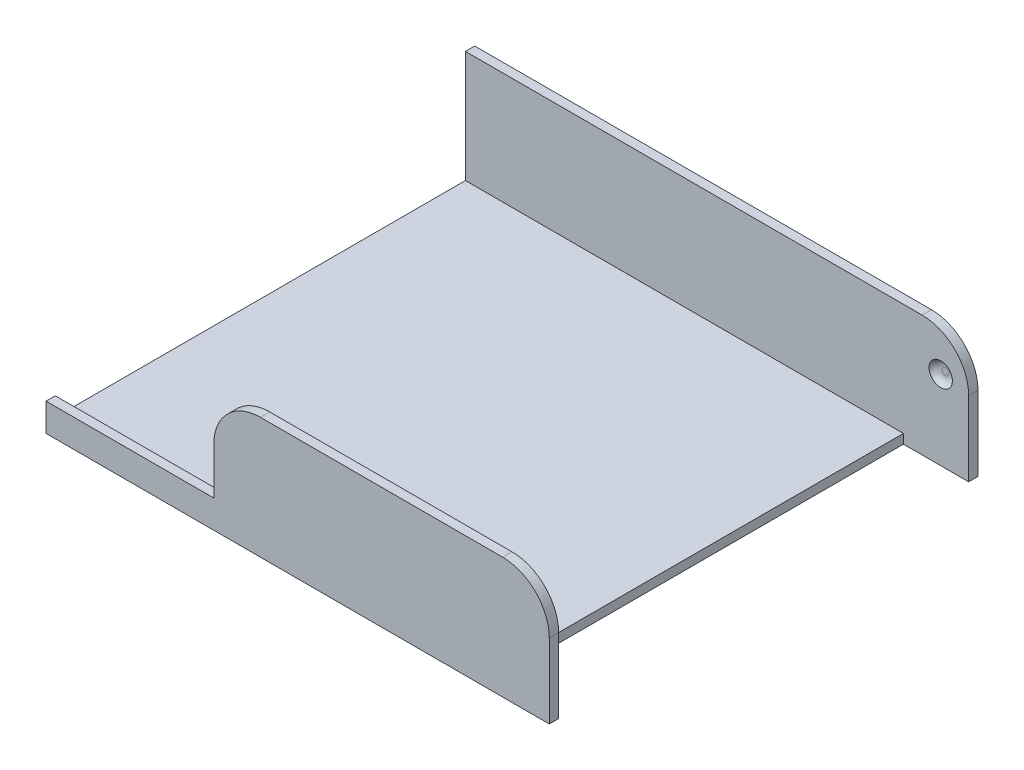
ISO-10303-21;
HEADER;
FILE_DESCRIPTION(('STEP AP214'),'2;1');
FILE_NAME('part.step','',(''),(''),'','','');
FILE_SCHEMA(('AUTOMOTIVE_DESIGN { 1 0 10303 214 1 1 1 1 }'));
ENDSEC;
DATA;
#1=APPLICATION_CONTEXT('core data for automotive mechanical design processes');
#2=APPLICATION_PROTOCOL_DEFINITION('international standard','automotive_design',2000,#1);
#3=PRODUCT_CONTEXT('',#1,'mechanical');
#4=PRODUCT('Part','Part','',(#3));
#5=PRODUCT_RELATED_PRODUCT_CATEGORY('part','',(#4));
#6=PRODUCT_DEFINITION_FORMATION('','',#4);
#7=PRODUCT_DEFINITION_CONTEXT('part definition',#1,'design');
#8=PRODUCT_DEFINITION('design','',#6,#7);
#9=PRODUCT_DEFINITION_SHAPE('','',#8);
#10=(LENGTH_UNIT() NAMED_UNIT(*) SI_UNIT(.MILLI.,.METRE.));
#11=(NAMED_UNIT(*) PLANE_ANGLE_UNIT() SI_UNIT($,.RADIAN.));
#12=(NAMED_UNIT(*) SI_UNIT($,.STERADIAN.) SOLID_ANGLE_UNIT());
#13=UNCERTAINTY_MEASURE_WITH_UNIT(LENGTH_MEASURE(1.E-05),#10,'distance_accuracy_value','');
#14=(GEOMETRIC_REPRESENTATION_CONTEXT(3) GLOBAL_UNCERTAINTY_ASSIGNED_CONTEXT((#13)) GLOBAL_UNIT_ASSIGNED_CONTEXT((#10,
#11,#12)) REPRESENTATION_CONTEXT('',''));
#15=CARTESIAN_POINT('',(0.,0.,0.));
#16=DIRECTION('',(0.,0.,1.));
#17=DIRECTION('',(1.,0.,0.));
#18=AXIS2_PLACEMENT_3D('',#15,#16,#17);
#19=CARTESIAN_POINT('',(108.,0.,0.));
#20=DIRECTION('',(1.,0.,0.));
#21=DIRECTION('',(0.,0.,-1.));
#22=AXIS2_PLACEMENT_3D('',#19,#20,#21);
#23=PLANE('',#22);
#24=DIRECTION('',(0.,-1.,0.));
#25=VECTOR('',#24,1.);
#26=CARTESIAN_POINT('',(108.,26.,-88.));
#27=LINE('',#26,#25);
#28=CARTESIAN_POINT('',(108.,16.,-88.));
#29=VERTEX_POINT('',#28);
#30=CARTESIAN_POINT('',(108.,0.,-88.));
#31=VERTEX_POINT('',#30);
#32=EDGE_CURVE('E203',#29,#31,#27,.T.);
#33=ORIENTED_EDGE('',*,*,#32,.T.);
#34=DIRECTION('',(0.,0.,-1.));
#35=VECTOR('',#34,1.);
#36=CARTESIAN_POINT('',(108.,0.,1.99999999999998));
#37=LINE('',#36,#35);
#38=CARTESIAN_POINT('',(108.,0.,-90.));
#39=VERTEX_POINT('',#38);
#40=EDGE_CURVE('E239',#31,#39,#37,.T.);
#41=ORIENTED_EDGE('',*,*,#40,.T.);
#42=DIRECTION('',(0.,1.,0.));
#43=VECTOR('',#42,1.);
#44=CARTESIAN_POINT('',(108.,26.,-90.));
#45=LINE('',#44,#43);
#46=CARTESIAN_POINT('',(108.,16.,-90.));
#47=VERTEX_POINT('',#46);
#48=EDGE_CURVE('E206',#39,#47,#45,.T.);
#49=ORIENTED_EDGE('',*,*,#48,.T.);
#50=DIRECTION('',(0.,0.,1.));
#51=VECTOR('',#50,1.);
#52=CARTESIAN_POINT('',(108.,16.,0.));
#53=LINE('',#52,#51);
#54=EDGE_CURVE('E197',#47,#29,#53,.T.);
#55=ORIENTED_EDGE('',*,*,#54,.T.);
#56=EDGE_LOOP('',(#33,#41,#49,#55));
#57=FACE_BOUND('',#56,.T.);
#58=ADVANCED_FACE('F35',(#57),#23,.T.);
#59=CARTESIAN_POINT('',(0.,26.,0.));
#60=DIRECTION('',(0.,1.,0.));
#61=DIRECTION('',(0.,0.,1.));
#62=AXIS2_PLACEMENT_3D('',#59,#60,#61);
#63=PLANE('',#62);
#64=DIRECTION('',(-1.,0.,0.));
#65=VECTOR('',#64,1.);
#66=CARTESIAN_POINT('',(0.,26.,-88.));
#67=LINE('',#66,#65);
#68=CARTESIAN_POINT('',(98.,26.,-88.));
#69=VERTEX_POINT('',#68);
#70=CARTESIAN_POINT('',(0.,26.,-88.));
#71=VERTEX_POINT('',#70);
#72=EDGE_CURVE('E218',#69,#71,#67,.T.);
#73=ORIENTED_EDGE('',*,*,#72,.F.);
#74=DIRECTION('',(0.,0.,1.));
#75=VECTOR('',#74,1.);
#76=CARTESIAN_POINT('',(98.,26.,0.));
#77=LINE('',#76,#75);
#78=CARTESIAN_POINT('',(98.,26.,-90.));
#79=VERTEX_POINT('',#78);
#80=EDGE_CURVE('E43',#69,#79,#77,.F.);
#81=ORIENTED_EDGE('',*,*,#80,.T.);
#82=DIRECTION('',(-1.,0.,0.));
#83=VECTOR('',#82,1.);
#84=CARTESIAN_POINT('',(-2.00000000000001,26.,-90.));
#85=LINE('',#84,#83);
#86=CARTESIAN_POINT('',(0.,26.,-90.));
#87=VERTEX_POINT('',#86);
#88=EDGE_CURVE('E170',#79,#87,#85,.T.);
#89=ORIENTED_EDGE('',*,*,#88,.T.);
#90=DIRECTION('',(0.,0.,-1.));
#91=VECTOR('',#90,1.);
#92=CARTESIAN_POINT('',(0.,26.,-90.));
#93=LINE('',#92,#91);
#94=EDGE_CURVE('E247',#71,#87,#93,.T.);
#95=ORIENTED_EDGE('',*,*,#94,.F.);
#96=EDGE_LOOP('',(#73,#81,#89,#95));
#97=FACE_BOUND('',#96,.T.);
#98=ADVANCED_FACE('F285',(#97),#63,.T.);
#99=CARTESIAN_POINT('',(-2.,26.,2.));
#100=DIRECTION('',(0.,0.,-1.));
#101=DIRECTION('',(-1.,0.,0.));
#102=AXIS2_PLACEMENT_3D('',#99,#100,#101);
#103=PLANE('',#102);
#104=DIRECTION('',(0.,-1.,0.));
#105=VECTOR('',#104,1.);
#106=CARTESIAN_POINT('',(108.,26.,2.));
#107=LINE('',#106,#105);
#108=CARTESIAN_POINT('',(108.,16.,1.99999999999999));
#109=VERTEX_POINT('',#108);
#110=CARTESIAN_POINT('',(108.,0.,2.));
#111=VERTEX_POINT('',#110);
#112=EDGE_CURVE('E275',#109,#111,#107,.T.);
#113=ORIENTED_EDGE('',*,*,#112,.F.);
#114=CARTESIAN_POINT('',(98.,16.,2.));
#115=DIRECTION('',(0.,0.,-1.));
#116=DIRECTION('',(-1.,0.,0.));
#117=AXIS2_PLACEMENT_3D('',#114,#115,#116);
#118=CIRCLE('',#117,10.);
#119=CARTESIAN_POINT('',(98.,26.,2.));
#120=VERTEX_POINT('',#119);
#121=EDGE_CURVE('E191',#109,#120,#118,.F.);
#122=ORIENTED_EDGE('',*,*,#121,.T.);
#123=DIRECTION('',(1.,0.,0.));
#124=VECTOR('',#123,1.);
#125=CARTESIAN_POINT('',(-2.,26.,2.));
#126=LINE('',#125,#124);
#127=CARTESIAN_POINT('',(46.,26.,2.));
#128=VERTEX_POINT('',#127);
#129=EDGE_CURVE('E224',#128,#120,#126,.T.);
#130=ORIENTED_EDGE('',*,*,#129,.F.);
#131=CARTESIAN_POINT('',(46.,16.,2.));
#132=DIRECTION('',(0.,0.,-1.));
#133=DIRECTION('',(-1.,0.,0.));
#134=AXIS2_PLACEMENT_3D('',#131,#132,#133);
#135=CIRCLE('',#134,10.);
#136=CARTESIAN_POINT('',(36.,16.,2.));
#137=VERTEX_POINT('',#136);
#138=EDGE_CURVE('E182',#128,#137,#135,.F.);
#139=ORIENTED_EDGE('',*,*,#138,.T.);
#140=DIRECTION('',(0.,1.,0.));
#141=VECTOR('',#140,1.);
#142=CARTESIAN_POINT('',(36.,26.,2.));
#143=LINE('',#142,#141);
#144=CARTESIAN_POINT('',(36.,6.,2.));
#145=VERTEX_POINT('',#144);
#146=EDGE_CURVE('E260',#145,#137,#143,.T.);
#147=ORIENTED_EDGE('',*,*,#146,.F.);
#148=DIRECTION('',(1.,0.,0.));
#149=VECTOR('',#148,1.);
#150=CARTESIAN_POINT('',(-2.,6.,2.));
#151=LINE('',#150,#149);
#152=CARTESIAN_POINT('',(0.,6.,2.));
#153=VERTEX_POINT('',#152);
#154=EDGE_CURVE('E255',#153,#145,#151,.T.);
#155=ORIENTED_EDGE('',*,*,#154,.F.);
#156=DIRECTION('',(0.,1.,0.));
#157=VECTOR('',#156,1.);
#158=CARTESIAN_POINT('',(0.,26.,2.));
#159=LINE('',#158,#157);
#160=CARTESIAN_POINT('',(0.,0.,2.));
#161=VERTEX_POINT('',#160);
#162=EDGE_CURVE('E245',#161,#153,#159,.T.);
#163=ORIENTED_EDGE('',*,*,#162,.F.);
#164=DIRECTION('',(1.,0.,0.));
#165=VECTOR('',#164,1.);
#166=CARTESIAN_POINT('',(-2.,0.,2.));
#167=LINE('',#166,#165);
#168=EDGE_CURVE('E223',#161,#111,#167,.T.);
#169=ORIENTED_EDGE('',*,*,#168,.T.);
#170=EDGE_LOOP('',(#113,#122,#130,#139,#147,#155,#163,#169));
#171=FACE_BOUND('',#170,.T.);
#172=ADVANCED_FACE('F301',(#171),#103,.F.);
#173=CARTESIAN_POINT('',(-2.00000000000001,26.,-90.));
#174=DIRECTION('',(0.,0.,1.));
#175=DIRECTION('',(1.,0.,0.));
#176=AXIS2_PLACEMENT_3D('',#173,#174,#175);
#177=PLANE('',#176);
#178=ORIENTED_EDGE('',*,*,#88,.F.);
#179=CARTESIAN_POINT('',(98.,16.,-90.));
#180=DIRECTION('',(0.,0.,1.));
#181=DIRECTION('',(1.,0.,0.));
#182=AXIS2_PLACEMENT_3D('',#179,#180,#181);
#183=CIRCLE('',#182,10.);
#184=EDGE_CURVE('E11',#79,#47,#183,.F.);
#185=ORIENTED_EDGE('',*,*,#184,.T.);
#186=ORIENTED_EDGE('',*,*,#48,.F.);
#187=DIRECTION('',(-1.,0.,0.));
#188=VECTOR('',#187,1.);
#189=CARTESIAN_POINT('',(-2.00000000000001,0.,-90.));
#190=LINE('',#189,#188);
#191=CARTESIAN_POINT('',(0.,0.,-90.));
#192=VERTEX_POINT('',#191);
#193=EDGE_CURVE('E227',#39,#192,#190,.T.);
#194=ORIENTED_EDGE('',*,*,#193,.T.);
#195=DIRECTION('',(0.,-1.,0.));
#196=VECTOR('',#195,1.);
#197=CARTESIAN_POINT('',(0.,26.,-90.));
#198=LINE('',#197,#196);
#199=EDGE_CURVE('E235',#87,#192,#198,.T.);
#200=ORIENTED_EDGE('',*,*,#199,.F.);
#201=EDGE_LOOP('',(#178,#185,#186,#194,#200));
#202=FACE_BOUND('',#201,.T.);
#203=ADVANCED_FACE('F234',(#202),#177,.F.);
#204=CARTESIAN_POINT('',(0.,0.,0.));
#205=DIRECTION('',(0.,-1.,0.));
#206=DIRECTION('',(0.,0.,-1.));
#207=AXIS2_PLACEMENT_3D('',#204,#205,#206);
#208=PLANE('',#207);
#209=DIRECTION('',(1.,0.,0.));
#210=VECTOR('',#209,1.);
#211=CARTESIAN_POINT('',(108.,0.,-88.));
#212=LINE('',#211,#210);
#213=CARTESIAN_POINT('',(94.,0.,-88.));
#214=VERTEX_POINT('',#213);
#215=EDGE_CURVE('E161',#214,#31,#212,.T.);
#216=ORIENTED_EDGE('',*,*,#215,.F.);
#217=DIRECTION('',(0.,0.,-1.));
#218=VECTOR('',#217,1.);
#219=CARTESIAN_POINT('',(94.,0.,0.));
#220=LINE('',#219,#218);
#221=CARTESIAN_POINT('',(94.,0.,0.));
#222=VERTEX_POINT('',#221);
#223=EDGE_CURVE('E319',#222,#214,#220,.T.);
#224=ORIENTED_EDGE('',*,*,#223,.F.);
#225=DIRECTION('',(-1.,0.,0.));
#226=VECTOR('',#225,1.);
#227=CARTESIAN_POINT('',(108.,0.,0.));
#228=LINE('',#227,#226);
#229=CARTESIAN_POINT('',(108.,0.,0.));
#230=VERTEX_POINT('',#229);
#231=EDGE_CURVE('E149',#230,#222,#228,.T.);
#232=ORIENTED_EDGE('',*,*,#231,.F.);
#233=EDGE_CURVE('E277',#111,#230,#37,.T.);
#234=ORIENTED_EDGE('',*,*,#233,.F.);
#235=ORIENTED_EDGE('',*,*,#168,.F.);
#236=DIRECTION('',(0.,0.,1.));
#237=VECTOR('',#236,1.);
#238=CARTESIAN_POINT('',(0.,0.,-90.));
#239=LINE('',#238,#237);
#240=EDGE_CURVE('E241',#192,#161,#239,.T.);
#241=ORIENTED_EDGE('',*,*,#240,.F.);
#242=ORIENTED_EDGE('',*,*,#193,.F.);
#243=ORIENTED_EDGE('',*,*,#40,.F.);
#244=EDGE_LOOP('',(#216,#224,#232,#234,#235,#241,#242,#243));
#245=FACE_BOUND('',#244,.T.);
#246=ADVANCED_FACE('F238',(#245),#208,.T.);
#247=CARTESIAN_POINT('',(-2.,6.,0.));
#248=DIRECTION('',(0.,-1.,0.));
#249=DIRECTION('',(0.,0.,-1.));
#250=AXIS2_PLACEMENT_3D('',#247,#248,#249);
#251=PLANE('',#250);
#252=DIRECTION('',(0.,0.,-1.));
#253=VECTOR('',#252,1.);
#254=CARTESIAN_POINT('',(0.,6.,0.));
#255=LINE('',#254,#253);
#256=CARTESIAN_POINT('',(0.,6.,0.));
#257=VERTEX_POINT('',#256);
#258=EDGE_CURVE('E253',#153,#257,#255,.T.);
#259=ORIENTED_EDGE('',*,*,#258,.F.);
#260=ORIENTED_EDGE('',*,*,#154,.T.);
#261=DIRECTION('',(0.,0.,1.));
#262=VECTOR('',#261,1.);
#263=CARTESIAN_POINT('',(36.,6.,0.));
#264=LINE('',#263,#262);
#265=CARTESIAN_POINT('',(36.,6.,0.));
#266=VERTEX_POINT('',#265);
#267=EDGE_CURVE('E263',#266,#145,#264,.T.);
#268=ORIENTED_EDGE('',*,*,#267,.F.);
#269=DIRECTION('',(1.,0.,0.));
#270=VECTOR('',#269,1.);
#271=CARTESIAN_POINT('',(-2.,6.,0.));
#272=LINE('',#271,#270);
#273=EDGE_CURVE('E256',#257,#266,#272,.T.);
#274=ORIENTED_EDGE('',*,*,#273,.F.);
#275=EDGE_LOOP('',(#259,#260,#268,#274));
#276=FACE_BOUND('',#275,.T.);
#277=ADVANCED_FACE('F330',(#276),#251,.F.);
#278=ORIENTED_EDGE('',*,*,#129,.T.);
#279=DIRECTION('',(0.,0.,1.));
#280=VECTOR('',#279,1.);
#281=CARTESIAN_POINT('',(98.,26.,0.));
#282=LINE('',#281,#280);
#283=CARTESIAN_POINT('',(98.,26.,0.));
#284=VERTEX_POINT('',#283);
#285=EDGE_CURVE('E193',#120,#284,#282,.F.);
#286=ORIENTED_EDGE('',*,*,#285,.T.);
#287=DIRECTION('',(1.,0.,0.));
#288=VECTOR('',#287,1.);
#289=CARTESIAN_POINT('',(0.,26.,0.));
#290=LINE('',#289,#288);
#291=CARTESIAN_POINT('',(46.,26.,0.));
#292=VERTEX_POINT('',#291);
#293=EDGE_CURVE('E281',#292,#284,#290,.T.);
#294=ORIENTED_EDGE('',*,*,#293,.F.);
#295=DIRECTION('',(0.,0.,1.));
#296=VECTOR('',#295,1.);
#297=CARTESIAN_POINT('',(46.,26.,2.));
#298=LINE('',#297,#296);
#299=EDGE_CURVE('E179',#292,#128,#298,.T.);
#300=ORIENTED_EDGE('',*,*,#299,.T.);
#301=EDGE_LOOP('',(#278,#286,#294,#300));
#302=FACE_BOUND('',#301,.T.);
#303=ADVANCED_FACE('F303',(#302),#63,.T.);
#304=CARTESIAN_POINT('',(0.,2.,0.));
#305=DIRECTION('',(0.,-1.,0.));
#306=DIRECTION('',(0.,0.,-1.));
#307=AXIS2_PLACEMENT_3D('',#304,#305,#306);
#308=PLANE('',#307);
#309=DIRECTION('',(1.,0.,0.));
#310=VECTOR('',#309,1.);
#311=CARTESIAN_POINT('',(0.,2.,0.));
#312=LINE('',#311,#310);
#313=CARTESIAN_POINT('',(0.,2.,0.));
#314=VERTEX_POINT('',#313);
#315=CARTESIAN_POINT('',(94.,2.,0.));
#316=VERTEX_POINT('',#315);
#317=EDGE_CURVE('E147',#314,#316,#312,.T.);
#318=ORIENTED_EDGE('',*,*,#317,.T.);
#319=DIRECTION('',(0.,0.,-1.));
#320=VECTOR('',#319,1.);
#321=CARTESIAN_POINT('',(94.,2.,0.));
#322=LINE('',#321,#320);
#323=CARTESIAN_POINT('',(94.,2.,-88.));
#324=VERTEX_POINT('',#323);
#325=EDGE_CURVE('E154',#316,#324,#322,.T.);
#326=ORIENTED_EDGE('',*,*,#325,.T.);
#327=DIRECTION('',(1.,0.,0.));
#328=VECTOR('',#327,1.);
#329=CARTESIAN_POINT('',(0.,2.,-88.));
#330=LINE('',#329,#328);
#331=CARTESIAN_POINT('',(0.,2.,-88.));
#332=VERTEX_POINT('',#331);
#333=EDGE_CURVE('E166',#332,#324,#330,.T.);
#334=ORIENTED_EDGE('',*,*,#333,.F.);
#335=DIRECTION('',(0.,0.,1.));
#336=VECTOR('',#335,1.);
#337=CARTESIAN_POINT('',(0.,2.,-88.));
#338=LINE('',#337,#336);
#339=EDGE_CURVE('E165',#332,#314,#338,.T.);
#340=ORIENTED_EDGE('',*,*,#339,.T.);
#341=EDGE_LOOP('',(#318,#326,#334,#340));
#342=FACE_BOUND('',#341,.T.);
#343=ADVANCED_FACE('F164',(#342),#308,.F.);
#344=CARTESIAN_POINT('',(0.,26.,0.));
#345=DIRECTION('',(0.,0.,-1.));
#346=DIRECTION('',(-1.,0.,0.));
#347=AXIS2_PLACEMENT_3D('',#344,#345,#346);
#348=PLANE('',#347);
#349=ORIENTED_EDGE('',*,*,#293,.T.);
#350=CARTESIAN_POINT('',(98.,16.,0.));
#351=DIRECTION('',(0.,0.,-1.));
#352=DIRECTION('',(-1.,0.,0.));
#353=AXIS2_PLACEMENT_3D('',#350,#351,#352);
#354=CIRCLE('',#353,10.);
#355=CARTESIAN_POINT('',(108.,16.,0.));
#356=VERTEX_POINT('',#355);
#357=EDGE_CURVE('E195',#284,#356,#354,.T.);
#358=ORIENTED_EDGE('',*,*,#357,.T.);
#359=DIRECTION('',(0.,-1.,0.));
#360=VECTOR('',#359,1.);
#361=CARTESIAN_POINT('',(108.,26.,0.));
#362=LINE('',#361,#360);
#363=EDGE_CURVE('E212',#356,#230,#362,.T.);
#364=ORIENTED_EDGE('',*,*,#363,.T.);
#365=ORIENTED_EDGE('',*,*,#231,.T.);
#366=DIRECTION('',(0.,-1.,0.));
#367=VECTOR('',#366,1.);
#368=CARTESIAN_POINT('',(94.,2.,0.));
#369=LINE('',#368,#367);
#370=EDGE_CURVE('E140',#316,#222,#369,.T.);
#371=ORIENTED_EDGE('',*,*,#370,.F.);
#372=ORIENTED_EDGE('',*,*,#317,.F.);
#373=DIRECTION('',(0.,-1.,0.));
#374=VECTOR('',#373,1.);
#375=CARTESIAN_POINT('',(0.,26.,0.));
#376=LINE('',#375,#374);
#377=EDGE_CURVE('E215',#257,#314,#376,.T.);
#378=ORIENTED_EDGE('',*,*,#377,.F.);
#379=ORIENTED_EDGE('',*,*,#273,.T.);
#380=DIRECTION('',(0.,1.,0.));
#381=VECTOR('',#380,1.);
#382=CARTESIAN_POINT('',(36.,26.,0.));
#383=LINE('',#382,#381);
#384=CARTESIAN_POINT('',(36.,16.,0.));
#385=VERTEX_POINT('',#384);
#386=EDGE_CURVE('E259',#266,#385,#383,.T.);
#387=ORIENTED_EDGE('',*,*,#386,.T.);
#388=CARTESIAN_POINT('',(46.,16.,0.));
#389=DIRECTION('',(0.,0.,-1.));
#390=DIRECTION('',(-1.,0.,0.));
#391=AXIS2_PLACEMENT_3D('',#388,#389,#390);
#392=CIRCLE('',#391,10.);
#393=EDGE_CURVE('E186',#385,#292,#392,.T.);
#394=ORIENTED_EDGE('',*,*,#393,.T.);
#395=EDGE_LOOP('',(#349,#358,#364,#365,#371,#372,#378,#379,#387,#394));
#396=FACE_BOUND('',#395,.T.);
#397=CARTESIAN_POINT('',(102.,17.,0.));
#398=DIRECTION('',(0.,0.,-1.));
#399=DIRECTION('',(-1.,0.,0.));
#400=AXIS2_PLACEMENT_3D('',#397,#398,#399);
#401=CIRCLE('',#400,2.75000000000001);
#402=CARTESIAN_POINT('',(99.25,17.,0.));
#403=VERTEX_POINT('',#402);
#404=EDGE_CURVE('E272',#403,#403,#401,.T.);
#405=ORIENTED_EDGE('',*,*,#404,.F.);
#406=EDGE_LOOP('',(#405));
#407=FACE_BOUND('',#406,.T.);
#408=ADVANCED_FACE('F143',(#396,#407),#348,.T.);
#409=CARTESIAN_POINT('',(0.,26.,-88.));
#410=DIRECTION('',(0.,0.,1.));
#411=DIRECTION('',(1.,0.,0.));
#412=AXIS2_PLACEMENT_3D('',#409,#410,#411);
#413=PLANE('',#412);
#414=CARTESIAN_POINT('',(102.,17.,-88.));
#415=DIRECTION('',(0.,0.,1.));
#416=DIRECTION('',(1.,0.,0.));
#417=AXIS2_PLACEMENT_3D('',#414,#415,#416);
#418=CIRCLE('',#417,2.50000000000001);
#419=CARTESIAN_POINT('',(104.5,17.,-88.));
#420=VERTEX_POINT('',#419);
#421=EDGE_CURVE('E269',#420,#420,#418,.T.);
#422=ORIENTED_EDGE('',*,*,#421,.F.);
#423=EDGE_LOOP('',(#422));
#424=FACE_BOUND('',#423,.T.);
#425=ORIENTED_EDGE('',*,*,#32,.F.);
#426=CARTESIAN_POINT('',(98.,16.,-88.));
#427=DIRECTION('',(0.,0.,1.));
#428=DIRECTION('',(1.,0.,0.));
#429=AXIS2_PLACEMENT_3D('',#426,#427,#428);
#430=CIRCLE('',#429,10.);
#431=EDGE_CURVE('E57',#29,#69,#430,.T.);
#432=ORIENTED_EDGE('',*,*,#431,.T.);
#433=ORIENTED_EDGE('',*,*,#72,.T.);
#434=DIRECTION('',(0.,-1.,0.));
#435=VECTOR('',#434,1.);
#436=CARTESIAN_POINT('',(0.,26.,-88.));
#437=LINE('',#436,#435);
#438=EDGE_CURVE('E213',#71,#332,#437,.T.);
#439=ORIENTED_EDGE('',*,*,#438,.T.);
#440=ORIENTED_EDGE('',*,*,#333,.T.);
#441=DIRECTION('',(0.,-1.,0.));
#442=VECTOR('',#441,1.);
#443=CARTESIAN_POINT('',(94.,2.,-88.));
#444=LINE('',#443,#442);
#445=EDGE_CURVE('E153',#324,#214,#444,.T.);
#446=ORIENTED_EDGE('',*,*,#445,.T.);
#447=ORIENTED_EDGE('',*,*,#215,.T.);
#448=EDGE_LOOP('',(#425,#432,#433,#439,#440,#446,#447));
#449=FACE_BOUND('',#448,.T.);
#450=ADVANCED_FACE('F209',(#424,#449),#413,.T.);
#451=ORIENTED_EDGE('',*,*,#233,.T.);
#452=ORIENTED_EDGE('',*,*,#363,.F.);
#453=DIRECTION('',(0.,0.,1.));
#454=VECTOR('',#453,1.);
#455=CARTESIAN_POINT('',(108.,16.,0.));
#456=LINE('',#455,#454);
#457=EDGE_CURVE('E188',#356,#109,#456,.T.);
#458=ORIENTED_EDGE('',*,*,#457,.T.);
#459=ORIENTED_EDGE('',*,*,#112,.T.);
#460=EDGE_LOOP('',(#451,#452,#458,#459));
#461=FACE_BOUND('',#460,.T.);
#462=ADVANCED_FACE('F297',(#461),#23,.T.);
#463=CARTESIAN_POINT('',(102.,17.,1.));
#464=DIRECTION('',(0.,0.,-1.));
#465=DIRECTION('',(-1.,0.,0.));
#466=AXIS2_PLACEMENT_3D('',#463,#464,#465);
#467=PLANE('',#466);
#468=CARTESIAN_POINT('',(102.,17.,1.));
#469=DIRECTION('',(0.,0.,-1.));
#470=DIRECTION('',(-1.,0.,0.));
#471=AXIS2_PLACEMENT_3D('',#468,#469,#470);
#472=CIRCLE('',#471,1.01794919243113);
#473=CARTESIAN_POINT('',(100.982050807569,17.,1.));
#474=VERTEX_POINT('',#473);
#475=EDGE_CURVE('E168',#474,#474,#472,.T.);
#476=ORIENTED_EDGE('',*,*,#475,.T.);
#477=EDGE_LOOP('',(#476));
#478=FACE_BOUND('',#477,.T.);
#479=ADVANCED_FACE('F307',(#478),#467,.T.);
#480=CARTESIAN_POINT('',(102.,17.,-89.));
#481=DIRECTION('',(0.,0.,1.));
#482=DIRECTION('',(1.,0.,0.));
#483=AXIS2_PLACEMENT_3D('',#480,#481,#482);
#484=PLANE('',#483);
#485=CARTESIAN_POINT('',(102.,17.,-89.));
#486=DIRECTION('',(0.,0.,1.));
#487=DIRECTION('',(1.,0.,0.));
#488=AXIS2_PLACEMENT_3D('',#485,#486,#487);
#489=CIRCLE('',#488,0.767949192431133);
#490=CARTESIAN_POINT('',(102.767949192431,17.,-89.));
#491=VERTEX_POINT('',#490);
#492=EDGE_CURVE('E176',#491,#491,#489,.T.);
#493=ORIENTED_EDGE('',*,*,#492,.T.);
#494=EDGE_LOOP('',(#493));
#495=FACE_BOUND('',#494,.T.);
#496=ADVANCED_FACE('F313',(#495),#484,.T.);
#497=CARTESIAN_POINT('',(102.,17.,-1.));
#498=DIRECTION('',(0.,0.,1.));
#499=DIRECTION('',(1.,0.,0.));
#500=AXIS2_PLACEMENT_3D('',#497,#498,#499);
#501=DEGENERATE_TOROIDAL_SURFACE('',#500,1.01794919243113,2.,.T.);
#502=ORIENTED_EDGE('',*,*,#404,.T.);
#503=EDGE_LOOP('',(#502));
#504=FACE_BOUND('',#503,.T.);
#505=ORIENTED_EDGE('',*,*,#475,.F.);
#506=EDGE_LOOP('',(#505));
#507=FACE_BOUND('',#506,.T.);
#508=ADVANCED_FACE('F351',(#504,#507),#501,.F.);
#509=CARTESIAN_POINT('',(102.,17.,-87.));
#510=DIRECTION('',(0.,0.,-1.));
#511=DIRECTION('',(-1.,0.,0.));
#512=AXIS2_PLACEMENT_3D('',#509,#510,#511);
#513=DEGENERATE_TOROIDAL_SURFACE('',#512,0.767949192431133,2.,.T.);
#514=ORIENTED_EDGE('',*,*,#421,.T.);
#515=EDGE_LOOP('',(#514));
#516=FACE_BOUND('',#515,.T.);
#517=ORIENTED_EDGE('',*,*,#492,.F.);
#518=EDGE_LOOP('',(#517));
#519=FACE_BOUND('',#518,.T.);
#520=ADVANCED_FACE('F344',(#516,#519),#513,.F.);
#521=CARTESIAN_POINT('',(36.,26.,0.));
#522=DIRECTION('',(1.,0.,0.));
#523=DIRECTION('',(0.,0.,-1.));
#524=AXIS2_PLACEMENT_3D('',#521,#522,#523);
#525=PLANE('',#524);
#526=ORIENTED_EDGE('',*,*,#146,.T.);
#527=DIRECTION('',(0.,0.,1.));
#528=VECTOR('',#527,1.);
#529=CARTESIAN_POINT('',(36.,16.,0.));
#530=LINE('',#529,#528);
#531=EDGE_CURVE('E184',#137,#385,#530,.F.);
#532=ORIENTED_EDGE('',*,*,#531,.T.);
#533=ORIENTED_EDGE('',*,*,#386,.F.);
#534=ORIENTED_EDGE('',*,*,#267,.T.);
#535=EDGE_LOOP('',(#526,#532,#533,#534));
#536=FACE_BOUND('',#535,.T.);
#537=ADVANCED_FACE('F342',(#536),#525,.F.);
#538=CARTESIAN_POINT('',(0.,0.,0.));
#539=DIRECTION('',(-1.,0.,0.));
#540=DIRECTION('',(0.,0.,1.));
#541=AXIS2_PLACEMENT_3D('',#538,#539,#540);
#542=PLANE('',#541);
#543=ORIENTED_EDGE('',*,*,#339,.F.);
#544=ORIENTED_EDGE('',*,*,#438,.F.);
#545=ORIENTED_EDGE('',*,*,#94,.T.);
#546=ORIENTED_EDGE('',*,*,#199,.T.);
#547=ORIENTED_EDGE('',*,*,#240,.T.);
#548=ORIENTED_EDGE('',*,*,#162,.T.);
#549=ORIENTED_EDGE('',*,*,#258,.T.);
#550=ORIENTED_EDGE('',*,*,#377,.T.);
#551=EDGE_LOOP('',(#543,#544,#545,#546,#547,#548,#549,#550));
#552=FACE_BOUND('',#551,.T.);
#553=ADVANCED_FACE('F284',(#552),#542,.T.);
#554=CARTESIAN_POINT('',(46.,16.,0.));
#555=DIRECTION('',(0.,0.,-1.));
#556=DIRECTION('',(-1.,0.,0.));
#557=AXIS2_PLACEMENT_3D('',#554,#555,#556);
#558=CYLINDRICAL_SURFACE('',#557,10.);
#559=ORIENTED_EDGE('',*,*,#393,.F.);
#560=ORIENTED_EDGE('',*,*,#531,.F.);
#561=ORIENTED_EDGE('',*,*,#138,.F.);
#562=ORIENTED_EDGE('',*,*,#299,.F.);
#563=EDGE_LOOP('',(#559,#560,#561,#562));
#564=FACE_BOUND('',#563,.T.);
#565=ADVANCED_FACE('F293',(#564),#558,.T.);
#566=CARTESIAN_POINT('',(98.,16.,0.));
#567=DIRECTION('',(0.,0.,1.));
#568=DIRECTION('',(1.,0.,0.));
#569=AXIS2_PLACEMENT_3D('',#566,#567,#568);
#570=CYLINDRICAL_SURFACE('',#569,10.);
#571=ORIENTED_EDGE('',*,*,#357,.F.);
#572=ORIENTED_EDGE('',*,*,#285,.F.);
#573=ORIENTED_EDGE('',*,*,#121,.F.);
#574=ORIENTED_EDGE('',*,*,#457,.F.);
#575=EDGE_LOOP('',(#571,#572,#573,#574));
#576=FACE_BOUND('',#575,.T.);
#577=ADVANCED_FACE('F287',(#576),#570,.T.);
#578=CARTESIAN_POINT('',(98.,16.,0.));
#579=DIRECTION('',(0.,0.,1.));
#580=DIRECTION('',(1.,0.,0.));
#581=AXIS2_PLACEMENT_3D('',#578,#579,#580);
#582=CYLINDRICAL_SURFACE('',#581,10.);
#583=ORIENTED_EDGE('',*,*,#184,.F.);
#584=ORIENTED_EDGE('',*,*,#80,.F.);
#585=ORIENTED_EDGE('',*,*,#431,.F.);
#586=ORIENTED_EDGE('',*,*,#54,.F.);
#587=EDGE_LOOP('',(#583,#584,#585,#586));
#588=FACE_BOUND('',#587,.T.);
#589=ADVANCED_FACE('F37',(#588),#582,.T.);
#590=CARTESIAN_POINT('',(94.,2.,0.));
#591=DIRECTION('',(-1.,0.,0.));
#592=DIRECTION('',(0.,0.,1.));
#593=AXIS2_PLACEMENT_3D('',#590,#591,#592);
#594=PLANE('',#593);
#595=ORIENTED_EDGE('',*,*,#223,.T.);
#596=ORIENTED_EDGE('',*,*,#445,.F.);
#597=ORIENTED_EDGE('',*,*,#325,.F.);
#598=ORIENTED_EDGE('',*,*,#370,.T.);
#599=EDGE_LOOP('',(#595,#596,#597,#598));
#600=FACE_BOUND('',#599,.T.);
#601=ADVANCED_FACE('F157',(#600),#594,.F.);
#602=CLOSED_SHELL('',(#58,#98,#172,#203,#246,#277,#303,#343,#408,#450,#462,#479,#496,#508,#520,
#537,#553,#565,#577,#589,#601));
#603=MANIFOLD_SOLID_BREP('B2',#602);
#604=ADVANCED_BREP_SHAPE_REPRESENTATION('',(#18,#603),#14);
#605=SHAPE_DEFINITION_REPRESENTATION(#9,#604);
ENDSEC;
END-ISO-10303-21;
